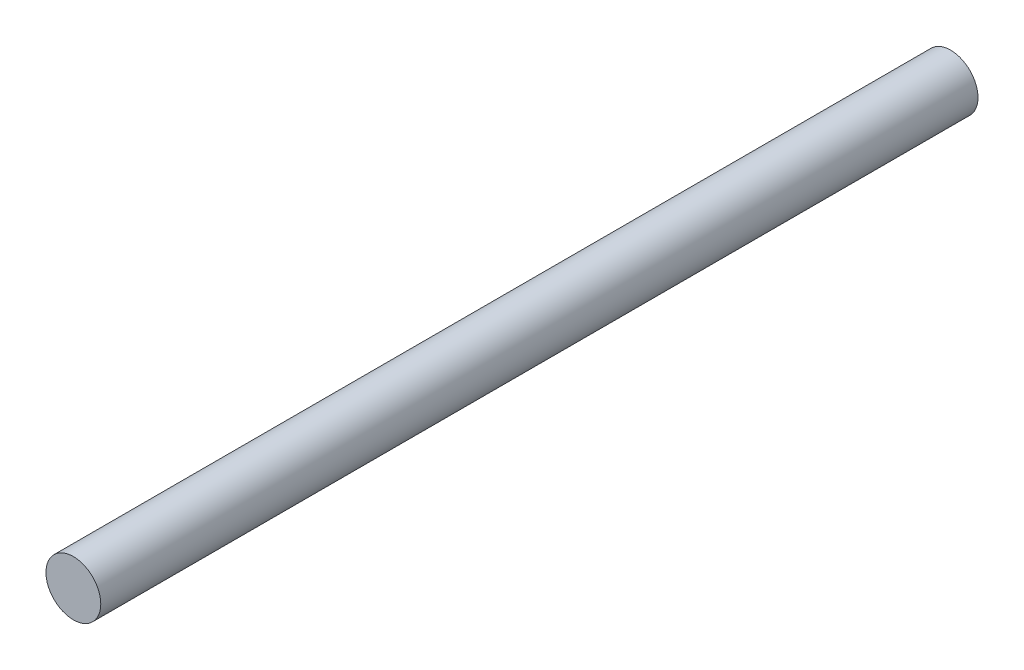
ISO-10303-21;
HEADER;
FILE_DESCRIPTION(('STEP AP214'),'2;1');
FILE_NAME('part.step','',(''),(''),'','','');
FILE_SCHEMA(('AUTOMOTIVE_DESIGN { 1 0 10303 214 1 1 1 1 }'));
ENDSEC;
DATA;
#1=APPLICATION_CONTEXT('core data for automotive mechanical design processes');
#2=APPLICATION_PROTOCOL_DEFINITION('international standard','automotive_design',2000,#1);
#3=PRODUCT_CONTEXT('',#1,'mechanical');
#4=PRODUCT('Part','Part','',(#3));
#5=PRODUCT_RELATED_PRODUCT_CATEGORY('part','',(#4));
#6=PRODUCT_DEFINITION_FORMATION('','',#4);
#7=PRODUCT_DEFINITION_CONTEXT('part definition',#1,'design');
#8=PRODUCT_DEFINITION('design','',#6,#7);
#9=PRODUCT_DEFINITION_SHAPE('','',#8);
#10=(LENGTH_UNIT() NAMED_UNIT(*) SI_UNIT(.MILLI.,.METRE.));
#11=(NAMED_UNIT(*) PLANE_ANGLE_UNIT() SI_UNIT($,.RADIAN.));
#12=(NAMED_UNIT(*) SI_UNIT($,.STERADIAN.) SOLID_ANGLE_UNIT());
#13=UNCERTAINTY_MEASURE_WITH_UNIT(LENGTH_MEASURE(1.E-05),#10,'distance_accuracy_value','');
#14=(GEOMETRIC_REPRESENTATION_CONTEXT(3) GLOBAL_UNCERTAINTY_ASSIGNED_CONTEXT((#13)) GLOBAL_UNIT_ASSIGNED_CONTEXT((#10,
#11,#12)) REPRESENTATION_CONTEXT('',''));
#15=CARTESIAN_POINT('',(0.,0.,0.));
#16=DIRECTION('',(0.,0.,1.));
#17=DIRECTION('',(1.,0.,0.));
#18=AXIS2_PLACEMENT_3D('',#15,#16,#17);
#19=CARTESIAN_POINT('',(0.,0.,-90.));
#20=DIRECTION('',(0.,0.,1.));
#21=DIRECTION('',(1.,0.,0.));
#22=AXIS2_PLACEMENT_3D('',#19,#20,#21);
#23=CYLINDRICAL_SURFACE('',#22,5.);
#24=CARTESIAN_POINT('',(0.,0.,-90.));
#25=DIRECTION('',(0.,0.,1.));
#26=DIRECTION('',(1.,0.,0.));
#27=AXIS2_PLACEMENT_3D('',#24,#25,#26);
#28=CIRCLE('',#27,5.);
#29=CARTESIAN_POINT('',(5.,0.,-90.));
#30=VERTEX_POINT('',#29);
#31=EDGE_CURVE('E10',#30,#30,#28,.T.);
#32=CARTESIAN_POINT('',(0.,0.,70.));
#33=DIRECTION('',(0.,0.,1.));
#34=DIRECTION('',(1.,0.,0.));
#35=AXIS2_PLACEMENT_3D('',#32,#33,#34);
#36=CIRCLE('',#35,5.);
#37=CARTESIAN_POINT('',(5.,0.,70.));
#38=VERTEX_POINT('',#37);
#39=EDGE_CURVE('E41',#38,#38,#36,.T.);
#40=CARTESIAN_POINT('',(5.,0.,-90.));
#41=CARTESIAN_POINT('',(5.,0.,-88.3333333333333));
#42=CARTESIAN_POINT('',(5.,0.,-86.6666666666667));
#43=CARTESIAN_POINT('',(5.,0.,-83.3333333333333));
#44=CARTESIAN_POINT('',(5.,0.,-81.6666666666667));
#45=CARTESIAN_POINT('',(5.,0.,-78.3333333333333));
#46=CARTESIAN_POINT('',(5.,0.,-76.6666666666667));
#47=CARTESIAN_POINT('',(5.,0.,-73.3333333333333));
#48=CARTESIAN_POINT('',(5.,0.,-71.6666666666667));
#49=CARTESIAN_POINT('',(5.,0.,-68.3333333333333));
#50=CARTESIAN_POINT('',(5.,0.,-66.6666666666667));
#51=CARTESIAN_POINT('',(5.,0.,-63.3333333333333));
#52=CARTESIAN_POINT('',(5.,0.,-61.6666666666667));
#53=CARTESIAN_POINT('',(5.,0.,-58.3333333333333));
#54=CARTESIAN_POINT('',(5.,0.,-56.6666666666667));
#55=CARTESIAN_POINT('',(5.,0.,-53.3333333333333));
#56=CARTESIAN_POINT('',(5.,0.,-51.6666666666667));
#57=CARTESIAN_POINT('',(5.,0.,-48.3333333333333));
#58=CARTESIAN_POINT('',(5.,0.,-46.6666666666667));
#59=CARTESIAN_POINT('',(5.,0.,-43.3333333333333));
#60=CARTESIAN_POINT('',(5.,0.,-41.6666666666667));
#61=CARTESIAN_POINT('',(5.,0.,-38.3333333333333));
#62=CARTESIAN_POINT('',(5.,0.,-36.6666666666667));
#63=CARTESIAN_POINT('',(5.,0.,-33.3333333333333));
#64=CARTESIAN_POINT('',(5.,0.,-31.6666666666667));
#65=CARTESIAN_POINT('',(5.,0.,-28.3333333333333));
#66=CARTESIAN_POINT('',(5.,0.,-26.6666666666667));
#67=CARTESIAN_POINT('',(5.,0.,-23.3333333333333));
#68=CARTESIAN_POINT('',(5.,0.,-21.6666666666667));
#69=CARTESIAN_POINT('',(5.,0.,-18.3333333333333));
#70=CARTESIAN_POINT('',(5.,0.,-16.6666666666667));
#71=CARTESIAN_POINT('',(5.,0.,-13.3333333333333));
#72=CARTESIAN_POINT('',(5.,0.,-11.6666666666667));
#73=CARTESIAN_POINT('',(5.,0.,-8.33333333333333));
#74=CARTESIAN_POINT('',(5.,0.,-6.66666666666666));
#75=CARTESIAN_POINT('',(5.,0.,-3.33333333333332));
#76=CARTESIAN_POINT('',(5.,0.,-1.66666666666665));
#77=CARTESIAN_POINT('',(5.,0.,1.66666666666668));
#78=CARTESIAN_POINT('',(5.,0.,3.33333333333334));
#79=CARTESIAN_POINT('',(5.,0.,6.66666666666667));
#80=CARTESIAN_POINT('',(5.,0.,8.33333333333334));
#81=CARTESIAN_POINT('',(5.,0.,11.6666666666667));
#82=CARTESIAN_POINT('',(5.,0.,13.3333333333333));
#83=CARTESIAN_POINT('',(5.,0.,16.6666666666667));
#84=CARTESIAN_POINT('',(5.,0.,18.3333333333333));
#85=CARTESIAN_POINT('',(5.,0.,21.6666666666667));
#86=CARTESIAN_POINT('',(5.,0.,23.3333333333333));
#87=CARTESIAN_POINT('',(5.,0.,26.6666666666667));
#88=CARTESIAN_POINT('',(5.,0.,28.3333333333333));
#89=CARTESIAN_POINT('',(5.,0.,31.6666666666667));
#90=CARTESIAN_POINT('',(5.,0.,33.3333333333333));
#91=CARTESIAN_POINT('',(5.,0.,36.6666666666667));
#92=CARTESIAN_POINT('',(5.,0.,38.3333333333333));
#93=CARTESIAN_POINT('',(5.,0.,41.6666666666667));
#94=CARTESIAN_POINT('',(5.,0.,43.3333333333333));
#95=CARTESIAN_POINT('',(5.,0.,46.6666666666667));
#96=CARTESIAN_POINT('',(5.,0.,48.3333333333333));
#97=CARTESIAN_POINT('',(5.,0.,51.6666666666667));
#98=CARTESIAN_POINT('',(5.,0.,53.3333333333333));
#99=CARTESIAN_POINT('',(5.,0.,56.6666666666667));
#100=CARTESIAN_POINT('',(5.,0.,58.3333333333333));
#101=CARTESIAN_POINT('',(5.,0.,61.6666666666667));
#102=CARTESIAN_POINT('',(5.,0.,63.3333333333333));
#103=CARTESIAN_POINT('',(5.,0.,66.6666666666667));
#104=CARTESIAN_POINT('',(5.,0.,68.3333333333333));
#105=CARTESIAN_POINT('',(5.,0.,70.));
#106=B_SPLINE_CURVE_WITH_KNOTS('',3,(#40,#41,#42,#43,#44,#45,#46,#47,#48,#49,#50,#51,#52,#53,
#54,#55,#56,#57,#58,#59,#60,#61,#62,#63,#64,#65,#66,#67,#68,#69,#70,#71,#72,#73,#74,#75,#76,#77,
#78,#79,#80,#81,#82,#83,#84,#85,#86,#87,#88,#89,#90,#91,#92,#93,#94,#95,#96,#97,#98,#99,#100,
#101,#102,#103,#104,#105),.UNSPECIFIED.,.F.,.F.,(4,2,2,2,2,2,2,2,2,2,2,2,2,2,2,2,2,2,2,2,2,2,2,
2,2,2,2,2,2,2,2,2,4),(0.,4.99999999999999,9.99999999999999,15.,20.,25.,30.,35.,40.,45.,50.,55.,
60.,65.,70.,75.,80.,85.,90.,95.,100.,105.,110.,115.,120.,125.,130.,135.,140.,145.,150.,155.,
160.),.UNSPECIFIED.);
#107=EDGE_CURVE('BSEAM35',#30,#38,#106,.T.);
#108=ORIENTED_EDGE('',*,*,#31,.T.);
#109=ORIENTED_EDGE('',*,*,#39,.F.);
#110=ORIENTED_EDGE('',*,*,#107,.T.);
#111=ORIENTED_EDGE('',*,*,#107,.F.);
#112=EDGE_LOOP('',(#108,#110,#109,#111));
#113=FACE_BOUND('',#112,.T.);
#114=ADVANCED_FACE('F35',(#113),#23,.T.);
#115=CARTESIAN_POINT('',(0.,0.,-90.));
#116=DIRECTION('',(0.,0.,1.));
#117=DIRECTION('',(1.,0.,0.));
#118=AXIS2_PLACEMENT_3D('',#115,#116,#117);
#119=PLANE('',#118);
#120=ORIENTED_EDGE('',*,*,#31,.F.);
#121=EDGE_LOOP('',(#120));
#122=FACE_BOUND('',#121,.T.);
#123=ADVANCED_FACE('F50',(#122),#119,.F.);
#124=CARTESIAN_POINT('',(0.,0.,70.));
#125=DIRECTION('',(0.,0.,1.));
#126=DIRECTION('',(1.,0.,0.));
#127=AXIS2_PLACEMENT_3D('',#124,#125,#126);
#128=PLANE('',#127);
#129=ORIENTED_EDGE('',*,*,#39,.T.);
#130=EDGE_LOOP('',(#129));
#131=FACE_BOUND('',#130,.T.);
#132=ADVANCED_FACE('F47',(#131),#128,.T.);
#133=CLOSED_SHELL('',(#114,#123,#132));
#134=MANIFOLD_SOLID_BREP('B2',#133);
#135=ADVANCED_BREP_SHAPE_REPRESENTATION('',(#18,#134),#14);
#136=SHAPE_DEFINITION_REPRESENTATION(#9,#135);
ENDSEC;
END-ISO-10303-21;
